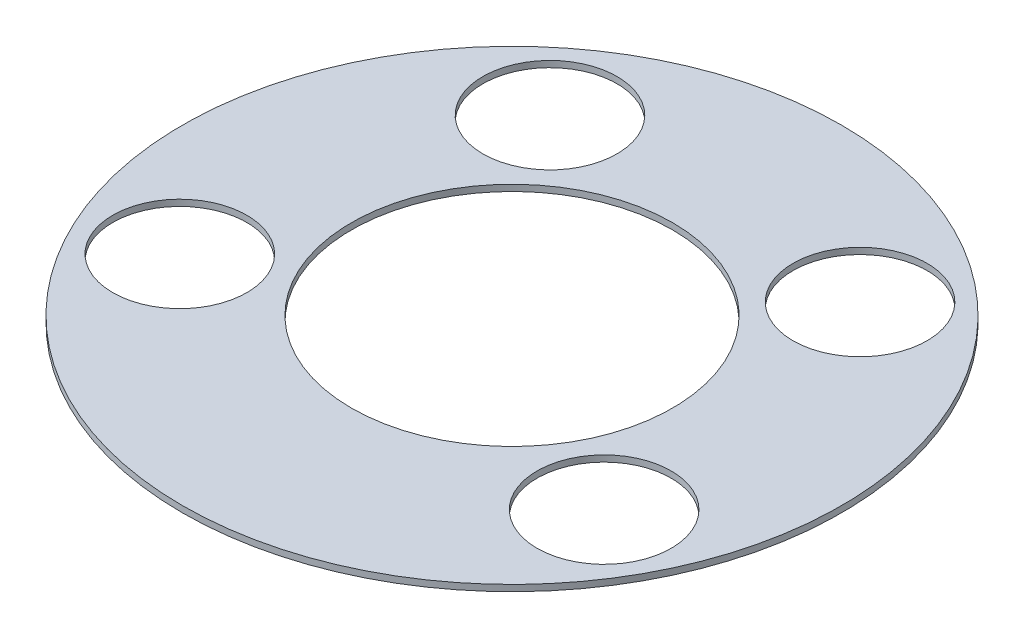
ISO-10303-21;
HEADER;
FILE_DESCRIPTION(('STEP AP214'),'2;1');
FILE_NAME('part.step','',(''),(''),'','','');
FILE_SCHEMA(('AUTOMOTIVE_DESIGN { 1 0 10303 214 1 1 1 1 }'));
ENDSEC;
DATA;
#1=APPLICATION_CONTEXT('core data for automotive mechanical design processes');
#2=APPLICATION_PROTOCOL_DEFINITION('international standard','automotive_design',2000,#1);
#3=PRODUCT_CONTEXT('',#1,'mechanical');
#4=PRODUCT('Part','Part','',(#3));
#5=PRODUCT_RELATED_PRODUCT_CATEGORY('part','',(#4));
#6=PRODUCT_DEFINITION_FORMATION('','',#4);
#7=PRODUCT_DEFINITION_CONTEXT('part definition',#1,'design');
#8=PRODUCT_DEFINITION('design','',#6,#7);
#9=PRODUCT_DEFINITION_SHAPE('','',#8);
#10=(LENGTH_UNIT() NAMED_UNIT(*) SI_UNIT(.MILLI.,.METRE.));
#11=(NAMED_UNIT(*) PLANE_ANGLE_UNIT() SI_UNIT($,.RADIAN.));
#12=(NAMED_UNIT(*) SI_UNIT($,.STERADIAN.) SOLID_ANGLE_UNIT());
#13=UNCERTAINTY_MEASURE_WITH_UNIT(LENGTH_MEASURE(1.E-05),#10,'distance_accuracy_value','');
#14=(GEOMETRIC_REPRESENTATION_CONTEXT(3) GLOBAL_UNCERTAINTY_ASSIGNED_CONTEXT((#13)) GLOBAL_UNIT_ASSIGNED_CONTEXT((#10,
#11,#12)) REPRESENTATION_CONTEXT('',''));
#15=CARTESIAN_POINT('',(0.,0.,0.));
#16=DIRECTION('',(0.,0.,1.));
#17=DIRECTION('',(1.,0.,0.));
#18=AXIS2_PLACEMENT_3D('',#15,#16,#17);
#19=CARTESIAN_POINT('',(-9.27910221029167,1.,5.85741562280352));
#20=DIRECTION('',(0.,1.,0.));
#21=DIRECTION('',(0.,0.,1.));
#22=AXIS2_PLACEMENT_3D('',#19,#20,#21);
#23=PLANE('',#22);
#24=CARTESIAN_POINT('',(-44.1081090723645,1.,23.7846536979143));
#25=DIRECTION('',(0.,1.,0.));
#26=DIRECTION('',(0.,0.,1.));
#27=AXIS2_PLACEMENT_3D('',#24,#25,#26);
#28=CIRCLE('',#27,10.6500000000001);
#29=CARTESIAN_POINT('',(-44.1081090723645,1.,34.4346536979143));
#30=VERTEX_POINT('',#29);
#31=EDGE_CURVE('E60',#30,#30,#28,.T.);
#32=ORIENTED_EDGE('',*,*,#31,.F.);
#33=EDGE_LOOP('',(#32));
#34=FACE_BOUND('',#33,.T.);
#35=CARTESIAN_POINT('',(-33.7999305193775,1.,-24.6904904107749));
#36=DIRECTION('',(0.,1.,0.));
#37=DIRECTION('',(0.,0.,1.));
#38=AXIS2_PLACEMENT_3D('',#35,#36,#37);
#39=CIRCLE('',#38,10.65);
#40=CARTESIAN_POINT('',(-33.7999305193775,1.,-14.0404904107748));
#41=VERTEX_POINT('',#40);
#42=EDGE_CURVE('E48',#41,#41,#39,.T.);
#43=ORIENTED_EDGE('',*,*,#42,.F.);
#44=EDGE_LOOP('',(#43));
#45=FACE_BOUND('',#44,.T.);
#46=CARTESIAN_POINT('',(-9.27910221029167,1.,5.85741562280352));
#47=DIRECTION('',(0.,1.,0.));
#48=DIRECTION('',(0.,0.,1.));
#49=AXIS2_PLACEMENT_3D('',#46,#47,#48);
#50=CIRCLE('',#49,52.338);
#51=CARTESIAN_POINT('',(-9.27910221029167,1.,58.1954156228035));
#52=VERTEX_POINT('',#51);
#53=EDGE_CURVE('E10',#52,#52,#50,.T.);
#54=ORIENTED_EDGE('',*,*,#53,.T.);
#55=EDGE_LOOP('',(#54));
#56=FACE_BOUND('',#55,.T.);
#57=CARTESIAN_POINT('',(-9.27910221029167,1.,5.85741562280352));
#58=DIRECTION('',(0.,1.,0.));
#59=DIRECTION('',(0.,0.,1.));
#60=AXIS2_PLACEMENT_3D('',#57,#58,#59);
#61=CIRCLE('',#60,25.5059999999999);
#62=CARTESIAN_POINT('',(-9.27910221029167,1.,31.3634156228034));
#63=VERTEX_POINT('',#62);
#64=EDGE_CURVE('E43',#63,#63,#61,.T.);
#65=ORIENTED_EDGE('',*,*,#64,.F.);
#66=EDGE_LOOP('',(#65));
#67=FACE_BOUND('',#66,.T.);
#68=CARTESIAN_POINT('',(16.5240944641078,1.,-23.615294218374));
#69=DIRECTION('',(0.,1.,0.));
#70=DIRECTION('',(0.,0.,1.));
#71=AXIS2_PLACEMENT_3D('',#68,#69,#70);
#72=CIRCLE('',#71,10.6500000000001);
#73=CARTESIAN_POINT('',(16.5240944641078,1.,-12.9652942183739));
#74=VERTEX_POINT('',#73);
#75=EDGE_CURVE('E54',#74,#74,#72,.T.);
#76=ORIENTED_EDGE('',*,*,#75,.F.);
#77=EDGE_LOOP('',(#76));
#78=FACE_BOUND('',#77,.T.);
#79=CARTESIAN_POINT('',(24.7524234290982,1.,25.2558909921602));
#80=DIRECTION('',(0.,1.,0.));
#81=DIRECTION('',(0.,0.,1.));
#82=AXIS2_PLACEMENT_3D('',#79,#80,#81);
#83=CIRCLE('',#82,10.6500000000001);
#84=CARTESIAN_POINT('',(24.7524234290982,1.,35.9058909921603));
#85=VERTEX_POINT('',#84);
#86=EDGE_CURVE('E66',#85,#85,#83,.T.);
#87=ORIENTED_EDGE('',*,*,#86,.F.);
#88=EDGE_LOOP('',(#87));
#89=FACE_BOUND('',#88,.T.);
#90=ADVANCED_FACE('F32',(#34,#45,#56,#67,#78,#89),#23,.T.);
#91=CARTESIAN_POINT('',(-9.27910221029167,0.,5.85741562280352));
#92=DIRECTION('',(0.,1.,0.));
#93=DIRECTION('',(0.,0.,1.));
#94=AXIS2_PLACEMENT_3D('',#91,#92,#93);
#95=PLANE('',#94);
#96=CARTESIAN_POINT('',(-44.1081090723645,0.,23.7846536979143));
#97=DIRECTION('',(0.,1.,0.));
#98=DIRECTION('',(0.,0.,1.));
#99=AXIS2_PLACEMENT_3D('',#96,#97,#98);
#100=CIRCLE('',#99,10.6500000000001);
#101=CARTESIAN_POINT('',(-44.1081090723645,0.,34.4346536979143));
#102=VERTEX_POINT('',#101);
#103=EDGE_CURVE('E63',#102,#102,#100,.T.);
#104=ORIENTED_EDGE('',*,*,#103,.T.);
#105=EDGE_LOOP('',(#104));
#106=FACE_BOUND('',#105,.T.);
#107=CARTESIAN_POINT('',(-33.7999305193775,0.,-24.6904904107749));
#108=DIRECTION('',(0.,1.,0.));
#109=DIRECTION('',(0.,0.,1.));
#110=AXIS2_PLACEMENT_3D('',#107,#108,#109);
#111=CIRCLE('',#110,10.65);
#112=CARTESIAN_POINT('',(-33.7999305193775,0.,-14.0404904107748));
#113=VERTEX_POINT('',#112);
#114=EDGE_CURVE('E51',#113,#113,#111,.T.);
#115=ORIENTED_EDGE('',*,*,#114,.T.);
#116=EDGE_LOOP('',(#115));
#117=FACE_BOUND('',#116,.T.);
#118=CARTESIAN_POINT('',(-9.27910221029167,0.,5.85741562280352));
#119=DIRECTION('',(0.,1.,0.));
#120=DIRECTION('',(0.,0.,1.));
#121=AXIS2_PLACEMENT_3D('',#118,#119,#120);
#122=CIRCLE('',#121,52.338);
#123=CARTESIAN_POINT('',(-9.27910221029167,0.,58.1954156228035));
#124=VERTEX_POINT('',#123);
#125=EDGE_CURVE('E36',#124,#124,#122,.T.);
#126=ORIENTED_EDGE('',*,*,#125,.F.);
#127=EDGE_LOOP('',(#126));
#128=FACE_BOUND('',#127,.T.);
#129=CARTESIAN_POINT('',(-9.27910221029167,0.,5.85741562280352));
#130=DIRECTION('',(0.,1.,0.));
#131=DIRECTION('',(0.,0.,1.));
#132=AXIS2_PLACEMENT_3D('',#129,#130,#131);
#133=CIRCLE('',#132,25.5059999999999);
#134=CARTESIAN_POINT('',(-9.27910221029167,0.,31.3634156228034));
#135=VERTEX_POINT('',#134);
#136=EDGE_CURVE('E45',#135,#135,#133,.T.);
#137=ORIENTED_EDGE('',*,*,#136,.T.);
#138=EDGE_LOOP('',(#137));
#139=FACE_BOUND('',#138,.T.);
#140=CARTESIAN_POINT('',(16.5240944641078,0.,-23.615294218374));
#141=DIRECTION('',(0.,1.,0.));
#142=DIRECTION('',(0.,0.,1.));
#143=AXIS2_PLACEMENT_3D('',#140,#141,#142);
#144=CIRCLE('',#143,10.6500000000001);
#145=CARTESIAN_POINT('',(16.5240944641078,0.,-12.9652942183739));
#146=VERTEX_POINT('',#145);
#147=EDGE_CURVE('E57',#146,#146,#144,.T.);
#148=ORIENTED_EDGE('',*,*,#147,.T.);
#149=EDGE_LOOP('',(#148));
#150=FACE_BOUND('',#149,.T.);
#151=CARTESIAN_POINT('',(24.7524234290982,0.,25.2558909921602));
#152=DIRECTION('',(0.,1.,0.));
#153=DIRECTION('',(0.,0.,1.));
#154=AXIS2_PLACEMENT_3D('',#151,#152,#153);
#155=CIRCLE('',#154,10.6500000000001);
#156=CARTESIAN_POINT('',(24.7524234290982,0.,35.9058909921603));
#157=VERTEX_POINT('',#156);
#158=EDGE_CURVE('E69',#157,#157,#155,.T.);
#159=ORIENTED_EDGE('',*,*,#158,.T.);
#160=EDGE_LOOP('',(#159));
#161=FACE_BOUND('',#160,.T.);
#162=ADVANCED_FACE('F79',(#106,#117,#128,#139,#150,#161),#95,.F.);
#163=CARTESIAN_POINT('',(-9.27910221029167,1.,5.85741562280352));
#164=DIRECTION('',(0.,-1.,0.));
#165=DIRECTION('',(0.,0.,-1.));
#166=AXIS2_PLACEMENT_3D('',#163,#164,#165);
#167=CYLINDRICAL_SURFACE('',#166,52.338);
#168=ORIENTED_EDGE('',*,*,#53,.F.);
#169=EDGE_LOOP('',(#168));
#170=FACE_BOUND('',#169,.T.);
#171=ORIENTED_EDGE('',*,*,#125,.T.);
#172=EDGE_LOOP('',(#171));
#173=FACE_BOUND('',#172,.T.);
#174=ADVANCED_FACE('F34',(#170,#173),#167,.T.);
#175=CARTESIAN_POINT('',(-9.27910221029167,1.,5.85741562280352));
#176=DIRECTION('',(0.,-1.,0.));
#177=DIRECTION('',(0.,0.,-1.));
#178=AXIS2_PLACEMENT_3D('',#175,#176,#177);
#179=CYLINDRICAL_SURFACE('',#178,25.5059999999999);
#180=ORIENTED_EDGE('',*,*,#64,.T.);
#181=EDGE_LOOP('',(#180));
#182=FACE_BOUND('',#181,.T.);
#183=ORIENTED_EDGE('',*,*,#136,.F.);
#184=EDGE_LOOP('',(#183));
#185=FACE_BOUND('',#184,.T.);
#186=ADVANCED_FACE('F89',(#182,#185),#179,.F.);
#187=CARTESIAN_POINT('',(-33.7999305193775,1.,-24.6904904107749));
#188=DIRECTION('',(0.,-1.,0.));
#189=DIRECTION('',(0.,0.,-1.));
#190=AXIS2_PLACEMENT_3D('',#187,#188,#189);
#191=CYLINDRICAL_SURFACE('',#190,10.65);
#192=ORIENTED_EDGE('',*,*,#42,.T.);
#193=EDGE_LOOP('',(#192));
#194=FACE_BOUND('',#193,.T.);
#195=ORIENTED_EDGE('',*,*,#114,.F.);
#196=EDGE_LOOP('',(#195));
#197=FACE_BOUND('',#196,.T.);
#198=ADVANCED_FACE('F92',(#194,#197),#191,.F.);
#199=CARTESIAN_POINT('',(16.5240944641078,1.,-23.615294218374));
#200=DIRECTION('',(0.,-1.,0.));
#201=DIRECTION('',(0.,0.,-1.));
#202=AXIS2_PLACEMENT_3D('',#199,#200,#201);
#203=CYLINDRICAL_SURFACE('',#202,10.6500000000001);
#204=ORIENTED_EDGE('',*,*,#75,.T.);
#205=EDGE_LOOP('',(#204));
#206=FACE_BOUND('',#205,.T.);
#207=ORIENTED_EDGE('',*,*,#147,.F.);
#208=EDGE_LOOP('',(#207));
#209=FACE_BOUND('',#208,.T.);
#210=ADVANCED_FACE('F96',(#206,#209),#203,.F.);
#211=CARTESIAN_POINT('',(-44.1081090723645,1.,23.7846536979143));
#212=DIRECTION('',(0.,-1.,0.));
#213=DIRECTION('',(0.,0.,-1.));
#214=AXIS2_PLACEMENT_3D('',#211,#212,#213);
#215=CYLINDRICAL_SURFACE('',#214,10.6500000000001);
#216=ORIENTED_EDGE('',*,*,#31,.T.);
#217=EDGE_LOOP('',(#216));
#218=FACE_BOUND('',#217,.T.);
#219=ORIENTED_EDGE('',*,*,#103,.F.);
#220=EDGE_LOOP('',(#219));
#221=FACE_BOUND('',#220,.T.);
#222=ADVANCED_FACE('F100',(#218,#221),#215,.F.);
#223=CARTESIAN_POINT('',(24.7524234290982,1.,25.2558909921602));
#224=DIRECTION('',(0.,-1.,0.));
#225=DIRECTION('',(0.,0.,-1.));
#226=AXIS2_PLACEMENT_3D('',#223,#224,#225);
#227=CYLINDRICAL_SURFACE('',#226,10.6500000000001);
#228=ORIENTED_EDGE('',*,*,#86,.T.);
#229=EDGE_LOOP('',(#228));
#230=FACE_BOUND('',#229,.T.);
#231=ORIENTED_EDGE('',*,*,#158,.F.);
#232=EDGE_LOOP('',(#231));
#233=FACE_BOUND('',#232,.T.);
#234=ADVANCED_FACE('F75',(#230,#233),#227,.F.);
#235=CLOSED_SHELL('',(#90,#162,#174,#186,#198,#210,#222,#234));
#236=MANIFOLD_SOLID_BREP('B2',#235);
#237=ADVANCED_BREP_SHAPE_REPRESENTATION('',(#18,#236),#14);
#238=SHAPE_DEFINITION_REPRESENTATION(#9,#237);
ENDSEC;
END-ISO-10303-21;
